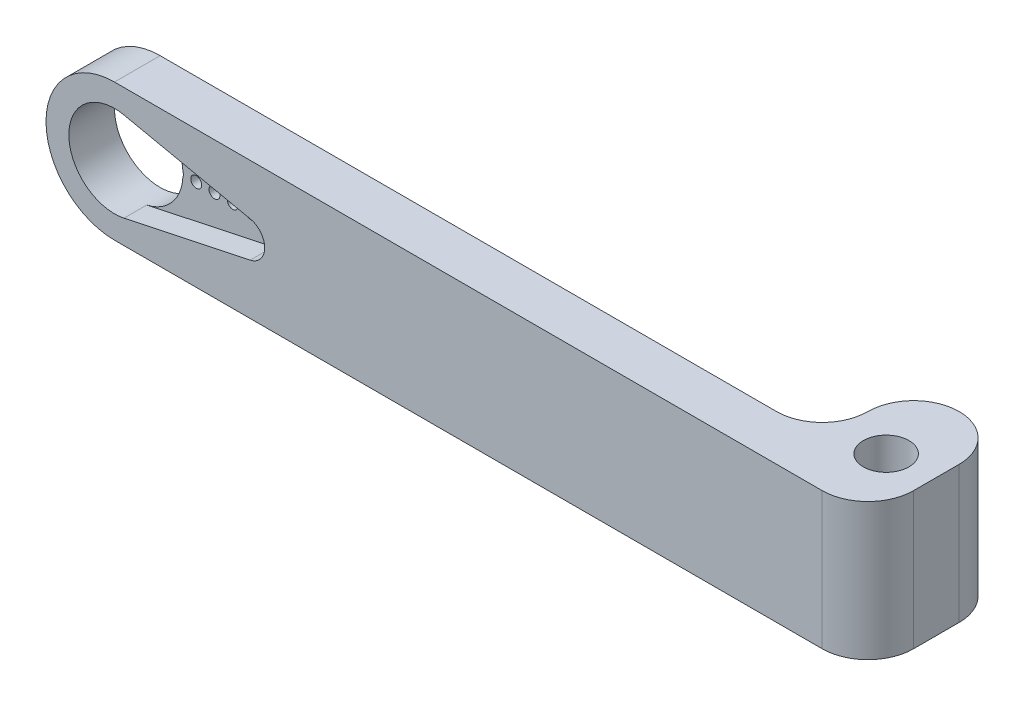
ISO-10303-21;
HEADER;
FILE_DESCRIPTION(('STEP AP214'),'2;1');
FILE_NAME('part.step','',(''),(''),'','','');
FILE_SCHEMA(('AUTOMOTIVE_DESIGN { 1 0 10303 214 1 1 1 1 }'));
ENDSEC;
DATA;
#1=APPLICATION_CONTEXT('core data for automotive mechanical design processes');
#2=APPLICATION_PROTOCOL_DEFINITION('international standard','automotive_design',2000,#1);
#3=PRODUCT_CONTEXT('',#1,'mechanical');
#4=PRODUCT('Part','Part','',(#3));
#5=PRODUCT_RELATED_PRODUCT_CATEGORY('part','',(#4));
#6=PRODUCT_DEFINITION_FORMATION('','',#4);
#7=PRODUCT_DEFINITION_CONTEXT('part definition',#1,'design');
#8=PRODUCT_DEFINITION('design','',#6,#7);
#9=PRODUCT_DEFINITION_SHAPE('','',#8);
#10=(LENGTH_UNIT() NAMED_UNIT(*) SI_UNIT(.MILLI.,.METRE.));
#11=(NAMED_UNIT(*) PLANE_ANGLE_UNIT() SI_UNIT($,.RADIAN.));
#12=(NAMED_UNIT(*) SI_UNIT($,.STERADIAN.) SOLID_ANGLE_UNIT());
#13=UNCERTAINTY_MEASURE_WITH_UNIT(LENGTH_MEASURE(1.E-05),#10,'distance_accuracy_value','');
#14=(GEOMETRIC_REPRESENTATION_CONTEXT(3) GLOBAL_UNCERTAINTY_ASSIGNED_CONTEXT((#13)) GLOBAL_UNIT_ASSIGNED_CONTEXT((#10,
#11,#12)) REPRESENTATION_CONTEXT('',''));
#15=CARTESIAN_POINT('',(0.,0.,0.));
#16=DIRECTION('',(0.,0.,1.));
#17=DIRECTION('',(1.,0.,0.));
#18=AXIS2_PLACEMENT_3D('',#15,#16,#17);
#19=CARTESIAN_POINT('',(0.,0.,5.));
#20=DIRECTION('',(0.,0.,-1.));
#21=DIRECTION('',(-1.,0.,0.));
#22=AXIS2_PLACEMENT_3D('',#19,#20,#21);
#23=CYLINDRICAL_SURFACE('',#22,5.);
#24=DIRECTION('',(0.,0.,1.));
#25=VECTOR('',#24,1.);
#26=CARTESIAN_POINT('',(1.03806228373702,4.89105578531698,2.5));
#27=LINE('',#26,#25);
#28=CARTESIAN_POINT('',(1.03806228373702,4.89105578531698,2.5));
#29=VERTEX_POINT('',#28);
#30=CARTESIAN_POINT('',(1.03806228373702,4.89105578531698,5.));
#31=VERTEX_POINT('',#30);
#32=EDGE_CURVE('E195',#29,#31,#27,.T.);
#33=ORIENTED_EDGE('',*,*,#32,.T.);
#34=CARTESIAN_POINT('',(0.,0.,5.));
#35=DIRECTION('',(0.,0.,1.));
#36=DIRECTION('',(1.,0.,0.));
#37=AXIS2_PLACEMENT_3D('',#34,#35,#36);
#38=CIRCLE('',#37,5.);
#39=CARTESIAN_POINT('',(1.03806228373702,-4.89105578531698,5.));
#40=VERTEX_POINT('',#39);
#41=EDGE_CURVE('E217',#31,#40,#38,.T.);
#42=ORIENTED_EDGE('',*,*,#41,.T.);
#43=DIRECTION('',(0.,0.,1.));
#44=VECTOR('',#43,1.);
#45=CARTESIAN_POINT('',(1.03806228373702,-4.89105578531698,2.5));
#46=LINE('',#45,#44);
#47=CARTESIAN_POINT('',(1.03806228373702,-4.89105578531698,2.5));
#48=VERTEX_POINT('',#47);
#49=EDGE_CURVE('E192',#48,#40,#46,.T.);
#50=ORIENTED_EDGE('',*,*,#49,.F.);
#51=CARTESIAN_POINT('',(0.,0.,2.5));
#52=DIRECTION('',(0.,0.,1.));
#53=DIRECTION('',(1.,0.,0.));
#54=AXIS2_PLACEMENT_3D('',#51,#52,#53);
#55=CIRCLE('',#54,5.);
#56=CARTESIAN_POINT('',(4.9935393258427,-0.254096440869344,2.5));
#57=VERTEX_POINT('',#56);
#58=EDGE_CURVE('E158',#57,#48,#55,.F.);
#59=ORIENTED_EDGE('',*,*,#58,.F.);
#60=DIRECTION('',(0.,0.,1.));
#61=VECTOR('',#60,1.);
#62=CARTESIAN_POINT('',(4.9935393258427,-0.254096440869346,2.5));
#63=LINE('',#62,#61);
#64=CARTESIAN_POINT('',(4.9935393258427,-0.254096440869344,0.));
#65=VERTEX_POINT('',#64);
#66=EDGE_CURVE('E245',#65,#57,#63,.T.);
#67=ORIENTED_EDGE('',*,*,#66,.F.);
#68=CARTESIAN_POINT('',(0.,0.,0.));
#69=DIRECTION('',(0.,0.,1.));
#70=DIRECTION('',(1.,0.,0.));
#71=AXIS2_PLACEMENT_3D('',#68,#69,#70);
#72=CIRCLE('',#71,5.);
#73=CARTESIAN_POINT('',(4.9935393258427,0.254096440869344,0.));
#74=VERTEX_POINT('',#73);
#75=EDGE_CURVE('E202',#74,#65,#72,.T.);
#76=ORIENTED_EDGE('',*,*,#75,.F.);
#77=DIRECTION('',(0.,0.,1.));
#78=VECTOR('',#77,1.);
#79=CARTESIAN_POINT('',(4.9935393258427,0.254096440869346,2.5));
#80=LINE('',#79,#78);
#81=CARTESIAN_POINT('',(4.9935393258427,0.254096440869346,2.5));
#82=VERTEX_POINT('',#81);
#83=EDGE_CURVE('E243',#82,#74,#80,.F.);
#84=ORIENTED_EDGE('',*,*,#83,.F.);
#85=CARTESIAN_POINT('',(0.,0.,2.5));
#86=DIRECTION('',(0.,0.,1.));
#87=DIRECTION('',(1.,0.,0.));
#88=AXIS2_PLACEMENT_3D('',#85,#86,#87);
#89=CIRCLE('',#88,5.);
#90=EDGE_CURVE('E170',#29,#82,#89,.F.);
#91=ORIENTED_EDGE('',*,*,#90,.F.);
#92=EDGE_LOOP('',(#33,#42,#50,#59,#67,#76,#84,#91));
#93=FACE_BOUND('',#92,.T.);
#94=ADVANCED_FACE('F32',(#93),#23,.F.);
#95=CARTESIAN_POINT('',(4.45,0.,0.));
#96=DIRECTION('',(0.,0.,1.));
#97=DIRECTION('',(1.,0.,0.));
#98=AXIS2_PLACEMENT_3D('',#95,#96,#97);
#99=CYLINDRICAL_SURFACE('',#98,0.6);
#100=CARTESIAN_POINT('',(4.45,0.,2.5));
#101=DIRECTION('',(0.,0.,1.));
#102=DIRECTION('',(1.,0.,0.));
#103=AXIS2_PLACEMENT_3D('',#100,#101,#102);
#104=CIRCLE('',#103,0.6);
#105=EDGE_CURVE('E172',#82,#57,#104,.F.);
#106=ORIENTED_EDGE('',*,*,#105,.F.);
#107=ORIENTED_EDGE('',*,*,#83,.T.);
#108=CARTESIAN_POINT('',(4.45,0.,0.));
#109=DIRECTION('',(0.,0.,1.));
#110=DIRECTION('',(1.,0.,0.));
#111=AXIS2_PLACEMENT_3D('',#108,#109,#110);
#112=CIRCLE('',#111,0.6);
#113=EDGE_CURVE('E199',#65,#74,#112,.T.);
#114=ORIENTED_EDGE('',*,*,#113,.F.);
#115=ORIENTED_EDGE('',*,*,#66,.T.);
#116=EDGE_LOOP('',(#106,#107,#114,#115));
#117=FACE_BOUND('',#116,.T.);
#118=ADVANCED_FACE('F324',(#117),#99,.F.);
#119=CARTESIAN_POINT('',(14.45,0.,0.));
#120=DIRECTION('',(0.,0.,1.));
#121=DIRECTION('',(1.,0.,0.));
#122=AXIS2_PLACEMENT_3D('',#119,#120,#121);
#123=CYLINDRICAL_SURFACE('',#122,0.6);
#124=CARTESIAN_POINT('',(14.45,0.,0.));
#125=DIRECTION('',(0.,0.,1.));
#126=DIRECTION('',(1.,0.,0.));
#127=AXIS2_PLACEMENT_3D('',#124,#125,#126);
#128=CIRCLE('',#127,0.6);
#129=CARTESIAN_POINT('',(15.05,0.,0.));
#130=VERTEX_POINT('',#129);
#131=EDGE_CURVE('E194',#130,#130,#128,.T.);
#132=ORIENTED_EDGE('',*,*,#131,.F.);
#133=EDGE_LOOP('',(#132));
#134=FACE_BOUND('',#133,.T.);
#135=CARTESIAN_POINT('',(14.45,0.,2.5));
#136=DIRECTION('',(0.,0.,1.));
#137=DIRECTION('',(1.,0.,0.));
#138=AXIS2_PLACEMENT_3D('',#135,#136,#137);
#139=CIRCLE('',#138,0.6);
#140=CARTESIAN_POINT('',(15.05,0.,2.5));
#141=VERTEX_POINT('',#140);
#142=EDGE_CURVE('E145',#141,#141,#139,.F.);
#143=ORIENTED_EDGE('',*,*,#142,.F.);
#144=EDGE_LOOP('',(#143));
#145=FACE_BOUND('',#144,.T.);
#146=ADVANCED_FACE('F330',(#134,#145),#123,.F.);
#147=CARTESIAN_POINT('',(12.45,0.,0.));
#148=DIRECTION('',(0.,0.,1.));
#149=DIRECTION('',(1.,0.,0.));
#150=AXIS2_PLACEMENT_3D('',#147,#148,#149);
#151=CYLINDRICAL_SURFACE('',#150,0.6);
#152=CARTESIAN_POINT('',(12.45,0.,0.));
#153=DIRECTION('',(0.,0.,1.));
#154=DIRECTION('',(1.,0.,0.));
#155=AXIS2_PLACEMENT_3D('',#152,#153,#154);
#156=CIRCLE('',#155,0.6);
#157=CARTESIAN_POINT('',(13.05,0.,0.));
#158=VERTEX_POINT('',#157);
#159=EDGE_CURVE('E212',#158,#158,#156,.T.);
#160=ORIENTED_EDGE('',*,*,#159,.F.);
#161=EDGE_LOOP('',(#160));
#162=FACE_BOUND('',#161,.T.);
#163=CARTESIAN_POINT('',(12.45,0.,2.5));
#164=DIRECTION('',(0.,0.,1.));
#165=DIRECTION('',(1.,0.,0.));
#166=AXIS2_PLACEMENT_3D('',#163,#164,#165);
#167=CIRCLE('',#166,0.6);
#168=CARTESIAN_POINT('',(13.05,0.,2.5));
#169=VERTEX_POINT('',#168);
#170=EDGE_CURVE('E184',#169,#169,#167,.F.);
#171=ORIENTED_EDGE('',*,*,#170,.F.);
#172=EDGE_LOOP('',(#171));
#173=FACE_BOUND('',#172,.T.);
#174=ADVANCED_FACE('F480',(#162,#173),#151,.F.);
#175=CARTESIAN_POINT('',(10.45,0.,0.));
#176=DIRECTION('',(0.,0.,1.));
#177=DIRECTION('',(1.,0.,0.));
#178=AXIS2_PLACEMENT_3D('',#175,#176,#177);
#179=CYLINDRICAL_SURFACE('',#178,0.6);
#180=CARTESIAN_POINT('',(10.45,0.,0.));
#181=DIRECTION('',(0.,0.,1.));
#182=DIRECTION('',(1.,0.,0.));
#183=AXIS2_PLACEMENT_3D('',#180,#181,#182);
#184=CIRCLE('',#183,0.6);
#185=CARTESIAN_POINT('',(11.05,0.,0.));
#186=VERTEX_POINT('',#185);
#187=EDGE_CURVE('E209',#186,#186,#184,.T.);
#188=ORIENTED_EDGE('',*,*,#187,.F.);
#189=EDGE_LOOP('',(#188));
#190=FACE_BOUND('',#189,.T.);
#191=CARTESIAN_POINT('',(10.45,0.,2.5));
#192=DIRECTION('',(0.,0.,1.));
#193=DIRECTION('',(1.,0.,0.));
#194=AXIS2_PLACEMENT_3D('',#191,#192,#193);
#195=CIRCLE('',#194,0.6);
#196=CARTESIAN_POINT('',(11.05,0.,2.5));
#197=VERTEX_POINT('',#196);
#198=EDGE_CURVE('E181',#197,#197,#195,.F.);
#199=ORIENTED_EDGE('',*,*,#198,.F.);
#200=EDGE_LOOP('',(#199));
#201=FACE_BOUND('',#200,.T.);
#202=ADVANCED_FACE('F488',(#190,#201),#179,.F.);
#203=CARTESIAN_POINT('',(8.45,0.,0.));
#204=DIRECTION('',(0.,0.,1.));
#205=DIRECTION('',(1.,0.,0.));
#206=AXIS2_PLACEMENT_3D('',#203,#204,#205);
#207=CYLINDRICAL_SURFACE('',#206,0.6);
#208=CARTESIAN_POINT('',(8.45,0.,0.));
#209=DIRECTION('',(0.,0.,1.));
#210=DIRECTION('',(1.,0.,0.));
#211=AXIS2_PLACEMENT_3D('',#208,#209,#210);
#212=CIRCLE('',#211,0.6);
#213=CARTESIAN_POINT('',(9.05,0.,0.));
#214=VERTEX_POINT('',#213);
#215=EDGE_CURVE('E206',#214,#214,#212,.T.);
#216=ORIENTED_EDGE('',*,*,#215,.F.);
#217=EDGE_LOOP('',(#216));
#218=FACE_BOUND('',#217,.T.);
#219=CARTESIAN_POINT('',(8.45,0.,2.5));
#220=DIRECTION('',(0.,0.,1.));
#221=DIRECTION('',(1.,0.,0.));
#222=AXIS2_PLACEMENT_3D('',#219,#220,#221);
#223=CIRCLE('',#222,0.6);
#224=CARTESIAN_POINT('',(9.05,0.,2.5));
#225=VERTEX_POINT('',#224);
#226=EDGE_CURVE('E178',#225,#225,#223,.F.);
#227=ORIENTED_EDGE('',*,*,#226,.F.);
#228=EDGE_LOOP('',(#227));
#229=FACE_BOUND('',#228,.T.);
#230=ADVANCED_FACE('F496',(#218,#229),#207,.F.);
#231=CARTESIAN_POINT('',(6.45,0.,0.));
#232=DIRECTION('',(0.,0.,1.));
#233=DIRECTION('',(1.,0.,0.));
#234=AXIS2_PLACEMENT_3D('',#231,#232,#233);
#235=CYLINDRICAL_SURFACE('',#234,0.6);
#236=CARTESIAN_POINT('',(6.45,0.,0.));
#237=DIRECTION('',(0.,0.,1.));
#238=DIRECTION('',(1.,0.,0.));
#239=AXIS2_PLACEMENT_3D('',#236,#237,#238);
#240=CIRCLE('',#239,0.6);
#241=CARTESIAN_POINT('',(7.05,0.,0.));
#242=VERTEX_POINT('',#241);
#243=EDGE_CURVE('E203',#242,#242,#240,.T.);
#244=ORIENTED_EDGE('',*,*,#243,.F.);
#245=EDGE_LOOP('',(#244));
#246=FACE_BOUND('',#245,.T.);
#247=CARTESIAN_POINT('',(6.45,0.,2.5));
#248=DIRECTION('',(0.,0.,1.));
#249=DIRECTION('',(1.,0.,0.));
#250=AXIS2_PLACEMENT_3D('',#247,#248,#249);
#251=CIRCLE('',#250,0.6);
#252=CARTESIAN_POINT('',(7.05,0.,2.5));
#253=VERTEX_POINT('',#252);
#254=EDGE_CURVE('E175',#253,#253,#251,.F.);
#255=ORIENTED_EDGE('',*,*,#254,.F.);
#256=EDGE_LOOP('',(#255));
#257=FACE_BOUND('',#256,.T.);
#258=ADVANCED_FACE('F339',(#246,#257),#235,.F.);
#259=CARTESIAN_POINT('',(0.,0.,5.));
#260=DIRECTION('',(0.,0.,1.));
#261=DIRECTION('',(1.,0.,0.));
#262=AXIS2_PLACEMENT_3D('',#259,#260,#261);
#263=PLANE('',#262);
#264=DIRECTION('',(1.,0.,0.));
#265=VECTOR('',#264,1.);
#266=CARTESIAN_POINT('',(0.,-7.5,5.));
#267=LINE('',#266,#265);
#268=CARTESIAN_POINT('',(0.,-7.5,5.));
#269=VERTEX_POINT('',#268);
#270=CARTESIAN_POINT('',(77.5,-7.5,5.));
#271=VERTEX_POINT('',#270);
#272=EDGE_CURVE('E226',#269,#271,#267,.T.);
#273=ORIENTED_EDGE('',*,*,#272,.T.);
#274=DIRECTION('',(0.,1.,0.));
#275=VECTOR('',#274,1.);
#276=CARTESIAN_POINT('',(77.5,0.,5.));
#277=LINE('',#276,#275);
#278=CARTESIAN_POINT('',(77.5,7.5,5.));
#279=VERTEX_POINT('',#278);
#280=EDGE_CURVE('E265',#271,#279,#277,.T.);
#281=ORIENTED_EDGE('',*,*,#280,.T.);
#282=DIRECTION('',(-1.,0.,0.));
#283=VECTOR('',#282,1.);
#284=CARTESIAN_POINT('',(0.,7.5,5.));
#285=LINE('',#284,#283);
#286=CARTESIAN_POINT('',(0.,7.5,5.));
#287=VERTEX_POINT('',#286);
#288=EDGE_CURVE('E229',#279,#287,#285,.T.);
#289=ORIENTED_EDGE('',*,*,#288,.T.);
#290=CARTESIAN_POINT('',(0.,0.,5.));
#291=DIRECTION('',(0.,0.,1.));
#292=DIRECTION('',(1.,0.,0.));
#293=AXIS2_PLACEMENT_3D('',#290,#291,#292);
#294=CIRCLE('',#293,7.5);
#295=EDGE_CURVE('E223',#287,#269,#294,.T.);
#296=ORIENTED_EDGE('',*,*,#295,.T.);
#297=EDGE_LOOP('',(#273,#281,#289,#296));
#298=FACE_BOUND('',#297,.T.);
#299=DIRECTION('',(0.978211157063395,0.207612456747405,0.));
#300=VECTOR('',#299,1.);
#301=CARTESIAN_POINT('',(1.03806228373702,-4.89105578531698,5.));
#302=LINE('',#301,#300);
#303=CARTESIAN_POINT('',(14.8652249134948,-1.95642231412679,5.));
#304=VERTEX_POINT('',#303);
#305=EDGE_CURVE('E140',#40,#304,#302,.T.);
#306=ORIENTED_EDGE('',*,*,#305,.F.);
#307=ORIENTED_EDGE('',*,*,#41,.F.);
#308=DIRECTION('',(0.978211157063395,-0.207612456747405,0.));
#309=VECTOR('',#308,1.);
#310=CARTESIAN_POINT('',(1.03806228373702,4.89105578531698,5.));
#311=LINE('',#310,#309);
#312=CARTESIAN_POINT('',(14.8652249134948,1.95642231412679,5.));
#313=VERTEX_POINT('',#312);
#314=EDGE_CURVE('E160',#31,#313,#311,.T.);
#315=ORIENTED_EDGE('',*,*,#314,.T.);
#316=CARTESIAN_POINT('',(14.45,0.,5.));
#317=DIRECTION('',(0.,0.,1.));
#318=DIRECTION('',(1.,0.,0.));
#319=AXIS2_PLACEMENT_3D('',#316,#317,#318);
#320=CIRCLE('',#319,2.);
#321=EDGE_CURVE('E163',#304,#313,#320,.T.);
#322=ORIENTED_EDGE('',*,*,#321,.F.);
#323=EDGE_LOOP('',(#306,#307,#315,#322));
#324=FACE_BOUND('',#323,.T.);
#325=ADVANCED_FACE('F297',(#298,#324),#263,.T.);
#326=CARTESIAN_POINT('',(0.,0.,0.));
#327=DIRECTION('',(0.,0.,1.));
#328=DIRECTION('',(1.,0.,0.));
#329=AXIS2_PLACEMENT_3D('',#326,#327,#328);
#330=PLANE('',#329);
#331=ORIENTED_EDGE('',*,*,#243,.T.);
#332=EDGE_LOOP('',(#331));
#333=FACE_BOUND('',#332,.T.);
#334=ORIENTED_EDGE('',*,*,#215,.T.);
#335=EDGE_LOOP('',(#334));
#336=FACE_BOUND('',#335,.T.);
#337=ORIENTED_EDGE('',*,*,#187,.T.);
#338=EDGE_LOOP('',(#337));
#339=FACE_BOUND('',#338,.T.);
#340=ORIENTED_EDGE('',*,*,#159,.T.);
#341=EDGE_LOOP('',(#340));
#342=FACE_BOUND('',#341,.T.);
#343=ORIENTED_EDGE('',*,*,#131,.T.);
#344=EDGE_LOOP('',(#343));
#345=FACE_BOUND('',#344,.T.);
#346=ORIENTED_EDGE('',*,*,#75,.T.);
#347=ORIENTED_EDGE('',*,*,#113,.T.);
#348=EDGE_LOOP('',(#346,#347));
#349=FACE_BOUND('',#348,.T.);
#350=DIRECTION('',(-1.,0.,0.));
#351=VECTOR('',#350,1.);
#352=CARTESIAN_POINT('',(0.,7.5,0.));
#353=LINE('',#352,#351);
#354=CARTESIAN_POINT('',(67.5,7.5,0.));
#355=VERTEX_POINT('',#354);
#356=CARTESIAN_POINT('',(0.,7.5,0.));
#357=VERTEX_POINT('',#356);
#358=EDGE_CURVE('E227',#355,#357,#353,.T.);
#359=ORIENTED_EDGE('',*,*,#358,.F.);
#360=DIRECTION('',(0.,-1.,0.));
#361=VECTOR('',#360,1.);
#362=CARTESIAN_POINT('',(67.5,0.,0.));
#363=LINE('',#362,#361);
#364=CARTESIAN_POINT('',(67.5,-7.5,0.));
#365=VERTEX_POINT('',#364);
#366=EDGE_CURVE('E263',#355,#365,#363,.T.);
#367=ORIENTED_EDGE('',*,*,#366,.T.);
#368=DIRECTION('',(1.,0.,0.));
#369=VECTOR('',#368,1.);
#370=CARTESIAN_POINT('',(0.,-7.5,0.));
#371=LINE('',#370,#369);
#372=CARTESIAN_POINT('',(0.,-7.5,0.));
#373=VERTEX_POINT('',#372);
#374=EDGE_CURVE('E234',#373,#365,#371,.T.);
#375=ORIENTED_EDGE('',*,*,#374,.F.);
#376=CARTESIAN_POINT('',(0.,0.,0.));
#377=DIRECTION('',(0.,0.,1.));
#378=DIRECTION('',(1.,0.,0.));
#379=AXIS2_PLACEMENT_3D('',#376,#377,#378);
#380=CIRCLE('',#379,7.5);
#381=EDGE_CURVE('E220',#357,#373,#380,.T.);
#382=ORIENTED_EDGE('',*,*,#381,.F.);
#383=EDGE_LOOP('',(#359,#367,#375,#382));
#384=FACE_BOUND('',#383,.T.);
#385=ADVANCED_FACE('F338',(#333,#336,#339,#342,#345,#349,#384),#330,.F.);
#386=CARTESIAN_POINT('',(0.,0.,5.));
#387=DIRECTION('',(0.,0.,-1.));
#388=DIRECTION('',(-1.,0.,0.));
#389=AXIS2_PLACEMENT_3D('',#386,#387,#388);
#390=CYLINDRICAL_SURFACE('',#389,7.5);
#391=ORIENTED_EDGE('',*,*,#381,.T.);
#392=DIRECTION('',(0.,0.,-1.));
#393=VECTOR('',#392,1.);
#394=CARTESIAN_POINT('',(0.,-7.5,5.));
#395=LINE('',#394,#393);
#396=EDGE_CURVE('E240',#269,#373,#395,.T.);
#397=ORIENTED_EDGE('',*,*,#396,.F.);
#398=ORIENTED_EDGE('',*,*,#295,.F.);
#399=DIRECTION('',(0.,0.,-1.));
#400=VECTOR('',#399,1.);
#401=CARTESIAN_POINT('',(0.,7.5,5.));
#402=LINE('',#401,#400);
#403=EDGE_CURVE('E231',#287,#357,#402,.T.);
#404=ORIENTED_EDGE('',*,*,#403,.T.);
#405=EDGE_LOOP('',(#391,#397,#398,#404));
#406=FACE_BOUND('',#405,.T.);
#407=ADVANCED_FACE('F305',(#406),#390,.T.);
#408=CARTESIAN_POINT('',(0.,-7.5,5.));
#409=DIRECTION('',(0.,1.,0.));
#410=DIRECTION('',(0.,0.,1.));
#411=AXIS2_PLACEMENT_3D('',#408,#409,#410);
#412=PLANE('',#411);
#413=CARTESIAN_POINT('',(77.5,-7.5,-2.));
#414=DIRECTION('',(0.,1.,0.));
#415=DIRECTION('',(0.,0.,1.));
#416=AXIS2_PLACEMENT_3D('',#413,#414,#415);
#417=CIRCLE('',#416,2.5);
#418=CARTESIAN_POINT('',(77.5,-7.5,0.499999999999995));
#419=VERTEX_POINT('',#418);
#420=EDGE_CURVE('E278',#419,#419,#417,.T.);
#421=ORIENTED_EDGE('',*,*,#420,.T.);
#422=EDGE_LOOP('',(#421));
#423=FACE_BOUND('',#422,.T.);
#424=CARTESIAN_POINT('',(77.5,-7.5,-5.));
#425=DIRECTION('',(0.,1.,0.));
#426=DIRECTION('',(0.,0.,1.));
#427=AXIS2_PLACEMENT_3D('',#424,#425,#426);
#428=CIRCLE('',#427,5.);
#429=CARTESIAN_POINT('',(72.5,-7.5,-5.));
#430=VERTEX_POINT('',#429);
#431=CARTESIAN_POINT('',(77.5,-7.5,-10.));
#432=VERTEX_POINT('',#431);
#433=EDGE_CURVE('E56',#430,#432,#428,.F.);
#434=ORIENTED_EDGE('',*,*,#433,.T.);
#435=CARTESIAN_POINT('',(77.5,-7.5,-5.));
#436=DIRECTION('',(0.,1.,0.));
#437=DIRECTION('',(0.,0.,1.));
#438=AXIS2_PLACEMENT_3D('',#435,#436,#437);
#439=CIRCLE('',#438,5.);
#440=CARTESIAN_POINT('',(82.5,-7.5,-5.));
#441=VERTEX_POINT('',#440);
#442=EDGE_CURVE('E261',#432,#441,#439,.F.);
#443=ORIENTED_EDGE('',*,*,#442,.T.);
#444=DIRECTION('',(0.,0.,-1.));
#445=VECTOR('',#444,1.);
#446=CARTESIAN_POINT('',(82.5,-7.5,5.));
#447=LINE('',#446,#445);
#448=CARTESIAN_POINT('',(82.5,-7.5,0.));
#449=VERTEX_POINT('',#448);
#450=EDGE_CURVE('E190',#449,#441,#447,.T.);
#451=ORIENTED_EDGE('',*,*,#450,.F.);
#452=CARTESIAN_POINT('',(77.5,-7.5,0.));
#453=DIRECTION('',(0.,1.,0.));
#454=DIRECTION('',(0.,0.,1.));
#455=AXIS2_PLACEMENT_3D('',#452,#453,#454);
#456=CIRCLE('',#455,5.);
#457=EDGE_CURVE('E49',#449,#271,#456,.F.);
#458=ORIENTED_EDGE('',*,*,#457,.T.);
#459=ORIENTED_EDGE('',*,*,#272,.F.);
#460=ORIENTED_EDGE('',*,*,#396,.T.);
#461=ORIENTED_EDGE('',*,*,#374,.T.);
#462=CARTESIAN_POINT('',(67.5,-7.5,-5.));
#463=DIRECTION('',(0.,1.,0.));
#464=DIRECTION('',(0.,0.,1.));
#465=AXIS2_PLACEMENT_3D('',#462,#463,#464);
#466=CIRCLE('',#465,5.);
#467=EDGE_CURVE('E41',#365,#430,#466,.T.);
#468=ORIENTED_EDGE('',*,*,#467,.T.);
#469=EDGE_LOOP('',(#434,#443,#451,#458,#459,#460,#461,#468));
#470=FACE_BOUND('',#469,.T.);
#471=ADVANCED_FACE('F306',(#423,#470),#412,.F.);
#472=CARTESIAN_POINT('',(0.,7.5,5.));
#473=DIRECTION('',(0.,-1.,0.));
#474=DIRECTION('',(0.,0.,-1.));
#475=AXIS2_PLACEMENT_3D('',#472,#473,#474);
#476=PLANE('',#475);
#477=CARTESIAN_POINT('',(77.5,7.5,-2.));
#478=DIRECTION('',(0.,1.,0.));
#479=DIRECTION('',(0.,0.,1.));
#480=AXIS2_PLACEMENT_3D('',#477,#478,#479);
#481=CIRCLE('',#480,2.5);
#482=CARTESIAN_POINT('',(77.5,7.5,0.499999999999995));
#483=VERTEX_POINT('',#482);
#484=EDGE_CURVE('E273',#483,#483,#481,.T.);
#485=ORIENTED_EDGE('',*,*,#484,.F.);
#486=EDGE_LOOP('',(#485));
#487=FACE_BOUND('',#486,.T.);
#488=DIRECTION('',(0.,0.,-1.));
#489=VECTOR('',#488,1.);
#490=CARTESIAN_POINT('',(82.5,7.5,5.));
#491=LINE('',#490,#489);
#492=CARTESIAN_POINT('',(82.5,7.5,0.));
#493=VERTEX_POINT('',#492);
#494=CARTESIAN_POINT('',(82.5,7.5,-5.));
#495=VERTEX_POINT('',#494);
#496=EDGE_CURVE('E166',#493,#495,#491,.T.);
#497=ORIENTED_EDGE('',*,*,#496,.T.);
#498=CARTESIAN_POINT('',(77.5,7.5,-5.));
#499=DIRECTION('',(0.,-1.,0.));
#500=DIRECTION('',(0.,0.,-1.));
#501=AXIS2_PLACEMENT_3D('',#498,#499,#500);
#502=CIRCLE('',#501,5.);
#503=CARTESIAN_POINT('',(77.5,7.5,-10.));
#504=VERTEX_POINT('',#503);
#505=EDGE_CURVE('E257',#495,#504,#502,.F.);
#506=ORIENTED_EDGE('',*,*,#505,.T.);
#507=CARTESIAN_POINT('',(77.5,7.5,-5.));
#508=DIRECTION('',(0.,-1.,0.));
#509=DIRECTION('',(0.,0.,-1.));
#510=AXIS2_PLACEMENT_3D('',#507,#508,#509);
#511=CIRCLE('',#510,5.);
#512=CARTESIAN_POINT('',(72.5,7.5,-5.));
#513=VERTEX_POINT('',#512);
#514=EDGE_CURVE('E255',#504,#513,#511,.F.);
#515=ORIENTED_EDGE('',*,*,#514,.T.);
#516=CARTESIAN_POINT('',(67.5,7.5,-5.));
#517=DIRECTION('',(0.,-1.,0.));
#518=DIRECTION('',(0.,0.,-1.));
#519=AXIS2_PLACEMENT_3D('',#516,#517,#518);
#520=CIRCLE('',#519,5.);
#521=EDGE_CURVE('E11',#513,#355,#520,.T.);
#522=ORIENTED_EDGE('',*,*,#521,.T.);
#523=ORIENTED_EDGE('',*,*,#358,.T.);
#524=ORIENTED_EDGE('',*,*,#403,.F.);
#525=ORIENTED_EDGE('',*,*,#288,.F.);
#526=CARTESIAN_POINT('',(77.5,7.5,0.));
#527=DIRECTION('',(0.,-1.,0.));
#528=DIRECTION('',(0.,0.,-1.));
#529=AXIS2_PLACEMENT_3D('',#526,#527,#528);
#530=CIRCLE('',#529,5.);
#531=EDGE_CURVE('E253',#279,#493,#530,.F.);
#532=ORIENTED_EDGE('',*,*,#531,.T.);
#533=EDGE_LOOP('',(#497,#506,#515,#522,#523,#524,#525,#532));
#534=FACE_BOUND('',#533,.T.);
#535=ADVANCED_FACE('F290',(#487,#534),#476,.F.);
#536=CARTESIAN_POINT('',(1.03806228373702,-4.89105578531698,2.5));
#537=DIRECTION('',(0.207612456747405,-0.978211157063395,0.));
#538=DIRECTION('',(0.978211157063395,0.207612456747405,0.));
#539=AXIS2_PLACEMENT_3D('',#536,#537,#538);
#540=PLANE('',#539);
#541=ORIENTED_EDGE('',*,*,#305,.T.);
#542=DIRECTION('',(0.,0.,1.));
#543=VECTOR('',#542,1.);
#544=CARTESIAN_POINT('',(14.8652249134948,-1.95642231412679,2.5));
#545=LINE('',#544,#543);
#546=CARTESIAN_POINT('',(14.8652249134948,-1.95642231412679,2.5));
#547=VERTEX_POINT('',#546);
#548=EDGE_CURVE('E133',#547,#304,#545,.T.);
#549=ORIENTED_EDGE('',*,*,#548,.F.);
#550=DIRECTION('',(0.978211157063395,0.207612456747405,0.));
#551=VECTOR('',#550,1.);
#552=CARTESIAN_POINT('',(1.03806228373702,-4.89105578531698,2.5));
#553=LINE('',#552,#551);
#554=EDGE_CURVE('E137',#48,#547,#553,.T.);
#555=ORIENTED_EDGE('',*,*,#554,.F.);
#556=ORIENTED_EDGE('',*,*,#49,.T.);
#557=EDGE_LOOP('',(#541,#549,#555,#556));
#558=FACE_BOUND('',#557,.T.);
#559=ADVANCED_FACE('F135',(#558),#540,.F.);
#560=CARTESIAN_POINT('',(1.03806228373702,4.89105578531698,2.5));
#561=DIRECTION('',(-0.207612456747405,-0.978211157063395,0.));
#562=DIRECTION('',(0.978211157063395,-0.207612456747405,0.));
#563=AXIS2_PLACEMENT_3D('',#560,#561,#562);
#564=PLANE('',#563);
#565=ORIENTED_EDGE('',*,*,#314,.F.);
#566=ORIENTED_EDGE('',*,*,#32,.F.);
#567=DIRECTION('',(0.978211157063395,-0.207612456747405,0.));
#568=VECTOR('',#567,1.);
#569=CARTESIAN_POINT('',(1.03806228373702,4.89105578531698,2.5));
#570=LINE('',#569,#568);
#571=CARTESIAN_POINT('',(14.8652249134948,1.95642231412679,2.5));
#572=VERTEX_POINT('',#571);
#573=EDGE_CURVE('E153',#29,#572,#570,.T.);
#574=ORIENTED_EDGE('',*,*,#573,.T.);
#575=DIRECTION('',(0.,0.,1.));
#576=VECTOR('',#575,1.);
#577=CARTESIAN_POINT('',(14.8652249134948,1.95642231412679,2.5));
#578=LINE('',#577,#576);
#579=EDGE_CURVE('E144',#572,#313,#578,.T.);
#580=ORIENTED_EDGE('',*,*,#579,.T.);
#581=EDGE_LOOP('',(#565,#566,#574,#580));
#582=FACE_BOUND('',#581,.T.);
#583=ADVANCED_FACE('F368',(#582),#564,.T.);
#584=CARTESIAN_POINT('',(14.45,0.,2.5));
#585=DIRECTION('',(0.,0.,1.));
#586=DIRECTION('',(1.,0.,0.));
#587=AXIS2_PLACEMENT_3D('',#584,#585,#586);
#588=CYLINDRICAL_SURFACE('',#587,2.);
#589=ORIENTED_EDGE('',*,*,#321,.T.);
#590=ORIENTED_EDGE('',*,*,#579,.F.);
#591=CARTESIAN_POINT('',(14.45,0.,2.5));
#592=DIRECTION('',(0.,0.,1.));
#593=DIRECTION('',(1.,0.,0.));
#594=AXIS2_PLACEMENT_3D('',#591,#592,#593);
#595=CIRCLE('',#594,2.);
#596=EDGE_CURVE('E149',#547,#572,#595,.T.);
#597=ORIENTED_EDGE('',*,*,#596,.F.);
#598=ORIENTED_EDGE('',*,*,#548,.T.);
#599=EDGE_LOOP('',(#589,#590,#597,#598));
#600=FACE_BOUND('',#599,.T.);
#601=ADVANCED_FACE('F150',(#600),#588,.F.);
#602=CARTESIAN_POINT('',(0.,0.,2.5));
#603=DIRECTION('',(0.,0.,1.));
#604=DIRECTION('',(1.,0.,0.));
#605=AXIS2_PLACEMENT_3D('',#602,#603,#604);
#606=PLANE('',#605);
#607=ORIENTED_EDGE('',*,*,#554,.T.);
#608=ORIENTED_EDGE('',*,*,#596,.T.);
#609=ORIENTED_EDGE('',*,*,#573,.F.);
#610=ORIENTED_EDGE('',*,*,#90,.T.);
#611=ORIENTED_EDGE('',*,*,#105,.T.);
#612=ORIENTED_EDGE('',*,*,#58,.T.);
#613=EDGE_LOOP('',(#607,#608,#609,#610,#611,#612));
#614=FACE_BOUND('',#613,.T.);
#615=ORIENTED_EDGE('',*,*,#254,.T.);
#616=EDGE_LOOP('',(#615));
#617=FACE_BOUND('',#616,.T.);
#618=ORIENTED_EDGE('',*,*,#226,.T.);
#619=EDGE_LOOP('',(#618));
#620=FACE_BOUND('',#619,.T.);
#621=ORIENTED_EDGE('',*,*,#198,.T.);
#622=EDGE_LOOP('',(#621));
#623=FACE_BOUND('',#622,.T.);
#624=ORIENTED_EDGE('',*,*,#170,.T.);
#625=EDGE_LOOP('',(#624));
#626=FACE_BOUND('',#625,.T.);
#627=ORIENTED_EDGE('',*,*,#142,.T.);
#628=EDGE_LOOP('',(#627));
#629=FACE_BOUND('',#628,.T.);
#630=ADVANCED_FACE('F155',(#614,#617,#620,#623,#626,#629),#606,.T.);
#631=CARTESIAN_POINT('',(82.5,-7.5,5.));
#632=DIRECTION('',(1.,0.,0.));
#633=DIRECTION('',(0.,0.,-1.));
#634=AXIS2_PLACEMENT_3D('',#631,#632,#633);
#635=PLANE('',#634);
#636=ORIENTED_EDGE('',*,*,#450,.T.);
#637=DIRECTION('',(0.,1.,0.));
#638=VECTOR('',#637,1.);
#639=CARTESIAN_POINT('',(82.5,-7.5,-5.));
#640=LINE('',#639,#638);
#641=EDGE_CURVE('E250',#441,#495,#640,.T.);
#642=ORIENTED_EDGE('',*,*,#641,.T.);
#643=ORIENTED_EDGE('',*,*,#496,.F.);
#644=DIRECTION('',(0.,1.,0.));
#645=VECTOR('',#644,1.);
#646=CARTESIAN_POINT('',(82.5,-7.5,0.));
#647=LINE('',#646,#645);
#648=EDGE_CURVE('E248',#493,#449,#647,.F.);
#649=ORIENTED_EDGE('',*,*,#648,.T.);
#650=EDGE_LOOP('',(#636,#642,#643,#649));
#651=FACE_BOUND('',#650,.T.);
#652=ADVANCED_FACE('F293',(#651),#635,.T.);
#653=CARTESIAN_POINT('',(77.5,-7.5,-2.));
#654=DIRECTION('',(0.,1.,0.));
#655=DIRECTION('',(0.,0.,1.));
#656=AXIS2_PLACEMENT_3D('',#653,#654,#655);
#657=CYLINDRICAL_SURFACE('',#656,2.5);
#658=ORIENTED_EDGE('',*,*,#420,.F.);
#659=EDGE_LOOP('',(#658));
#660=FACE_BOUND('',#659,.T.);
#661=ORIENTED_EDGE('',*,*,#484,.T.);
#662=EDGE_LOOP('',(#661));
#663=FACE_BOUND('',#662,.T.);
#664=ADVANCED_FACE('F395',(#660,#663),#657,.F.);
#665=CARTESIAN_POINT('',(67.5,0.,-5.));
#666=DIRECTION('',(0.,-1.,0.));
#667=DIRECTION('',(0.,0.,-1.));
#668=AXIS2_PLACEMENT_3D('',#665,#666,#667);
#669=CYLINDRICAL_SURFACE('',#668,5.);
#670=ORIENTED_EDGE('',*,*,#366,.F.);
#671=ORIENTED_EDGE('',*,*,#521,.F.);
#672=DIRECTION('',(0.,-1.,0.));
#673=VECTOR('',#672,1.);
#674=CARTESIAN_POINT('',(72.5,-7.5,-5.));
#675=LINE('',#674,#673);
#676=EDGE_CURVE('E36',#430,#513,#675,.F.);
#677=ORIENTED_EDGE('',*,*,#676,.F.);
#678=ORIENTED_EDGE('',*,*,#467,.F.);
#679=EDGE_LOOP('',(#670,#671,#677,#678));
#680=FACE_BOUND('',#679,.T.);
#681=ADVANCED_FACE('F311',(#680),#669,.F.);
#682=CARTESIAN_POINT('',(77.5,-7.5,-5.));
#683=DIRECTION('',(0.,1.,0.));
#684=DIRECTION('',(0.,0.,1.));
#685=AXIS2_PLACEMENT_3D('',#682,#683,#684);
#686=CYLINDRICAL_SURFACE('',#685,5.);
#687=DIRECTION('',(0.,1.,0.));
#688=VECTOR('',#687,1.);
#689=CARTESIAN_POINT('',(77.5,-7.5,-10.));
#690=LINE('',#689,#688);
#691=EDGE_CURVE('E268',#432,#504,#690,.T.);
#692=ORIENTED_EDGE('',*,*,#691,.F.);
#693=ORIENTED_EDGE('',*,*,#433,.F.);
#694=ORIENTED_EDGE('',*,*,#676,.T.);
#695=ORIENTED_EDGE('',*,*,#514,.F.);
#696=EDGE_LOOP('',(#692,#693,#694,#695));
#697=FACE_BOUND('',#696,.T.);
#698=ADVANCED_FACE('F313',(#697),#686,.T.);
#699=CARTESIAN_POINT('',(77.5,-7.5,-5.));
#700=DIRECTION('',(0.,1.,0.));
#701=DIRECTION('',(0.,0.,1.));
#702=AXIS2_PLACEMENT_3D('',#699,#700,#701);
#703=CYLINDRICAL_SURFACE('',#702,5.);
#704=ORIENTED_EDGE('',*,*,#442,.F.);
#705=ORIENTED_EDGE('',*,*,#691,.T.);
#706=ORIENTED_EDGE('',*,*,#505,.F.);
#707=ORIENTED_EDGE('',*,*,#641,.F.);
#708=EDGE_LOOP('',(#704,#705,#706,#707));
#709=FACE_BOUND('',#708,.T.);
#710=ADVANCED_FACE('F314',(#709),#703,.T.);
#711=CARTESIAN_POINT('',(77.5,0.,0.));
#712=DIRECTION('',(0.,1.,0.));
#713=DIRECTION('',(0.,0.,1.));
#714=AXIS2_PLACEMENT_3D('',#711,#712,#713);
#715=CYLINDRICAL_SURFACE('',#714,5.);
#716=ORIENTED_EDGE('',*,*,#457,.F.);
#717=ORIENTED_EDGE('',*,*,#648,.F.);
#718=ORIENTED_EDGE('',*,*,#531,.F.);
#719=ORIENTED_EDGE('',*,*,#280,.F.);
#720=EDGE_LOOP('',(#716,#717,#718,#719));
#721=FACE_BOUND('',#720,.T.);
#722=ADVANCED_FACE('F34',(#721),#715,.T.);
#723=CLOSED_SHELL('',(#94,#118,#146,#174,#202,#230,#258,#325,#385,#407,#471,#535,#559,#583,#601,
#630,#652,#664,#681,#698,#710,#722));
#724=MANIFOLD_SOLID_BREP('B2',#723);
#725=ADVANCED_BREP_SHAPE_REPRESENTATION('',(#18,#724),#14);
#726=SHAPE_DEFINITION_REPRESENTATION(#9,#725);
ENDSEC;
END-ISO-10303-21;
